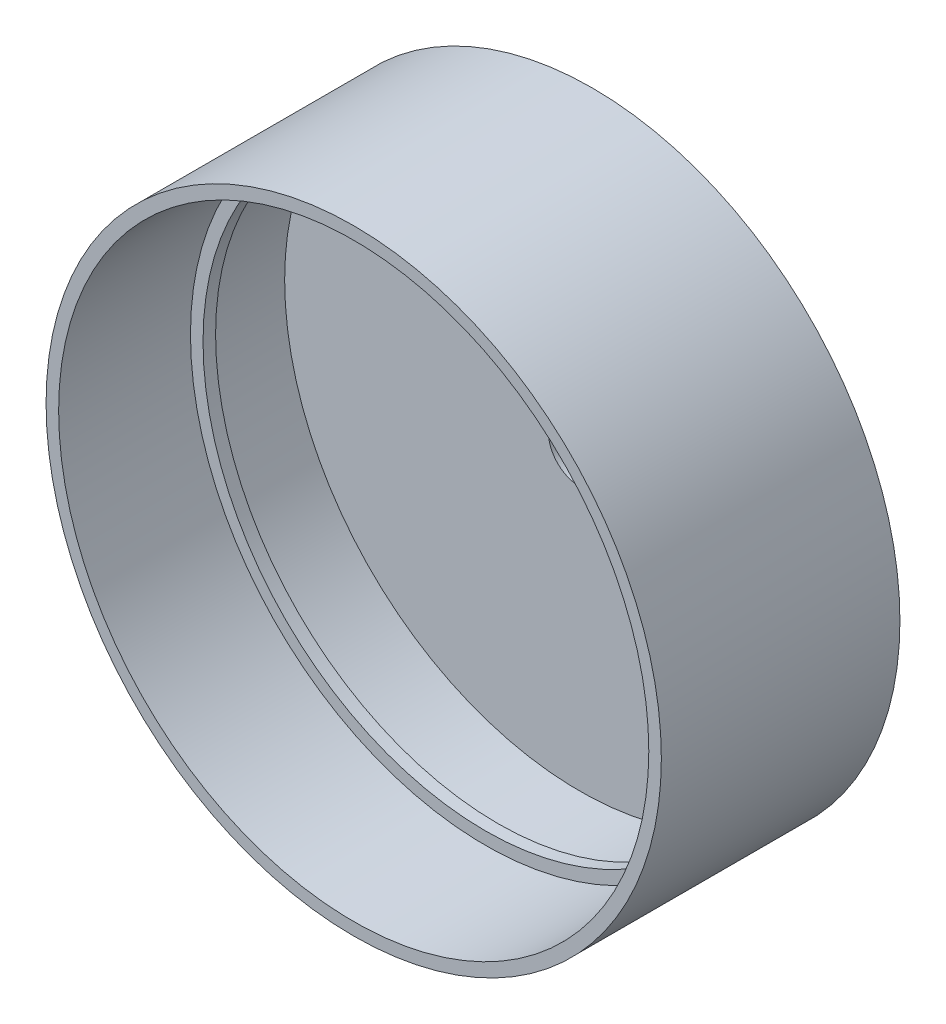
ISO-10303-21;
HEADER;
FILE_DESCRIPTION(('STEP AP214'),'2;1');
FILE_NAME('part.step','',(''),(''),'','','');
FILE_SCHEMA(('AUTOMOTIVE_DESIGN { 1 0 10303 214 1 1 1 1 }'));
ENDSEC;
DATA;
#1=APPLICATION_CONTEXT('core data for automotive mechanical design processes');
#2=APPLICATION_PROTOCOL_DEFINITION('international standard','automotive_design',2000,#1);
#3=PRODUCT_CONTEXT('',#1,'mechanical');
#4=PRODUCT('Part','Part','',(#3));
#5=PRODUCT_RELATED_PRODUCT_CATEGORY('part','',(#4));
#6=PRODUCT_DEFINITION_FORMATION('','',#4);
#7=PRODUCT_DEFINITION_CONTEXT('part definition',#1,'design');
#8=PRODUCT_DEFINITION('design','',#6,#7);
#9=PRODUCT_DEFINITION_SHAPE('','',#8);
#10=(LENGTH_UNIT() NAMED_UNIT(*) SI_UNIT(.MILLI.,.METRE.));
#11=(NAMED_UNIT(*) PLANE_ANGLE_UNIT() SI_UNIT($,.RADIAN.));
#12=(NAMED_UNIT(*) SI_UNIT($,.STERADIAN.) SOLID_ANGLE_UNIT());
#13=UNCERTAINTY_MEASURE_WITH_UNIT(LENGTH_MEASURE(1.E-05),#10,'distance_accuracy_value','');
#14=(GEOMETRIC_REPRESENTATION_CONTEXT(3) GLOBAL_UNCERTAINTY_ASSIGNED_CONTEXT((#13)) GLOBAL_UNIT_ASSIGNED_CONTEXT((#10,
#11,#12)) REPRESENTATION_CONTEXT('',''));
#15=CARTESIAN_POINT('',(0.,0.,0.));
#16=DIRECTION('',(0.,0.,1.));
#17=DIRECTION('',(1.,0.,0.));
#18=AXIS2_PLACEMENT_3D('',#15,#16,#17);
#19=CARTESIAN_POINT('',(0.,0.,38.));
#20=DIRECTION('',(0.,0.,-1.));
#21=DIRECTION('',(-1.,0.,0.));
#22=AXIS2_PLACEMENT_3D('',#19,#20,#21);
#23=CYLINDRICAL_SURFACE('',#22,47.);
#24=CARTESIAN_POINT('',(0.,0.,2.));
#25=DIRECTION('',(0.,0.,1.));
#26=DIRECTION('',(1.,0.,0.));
#27=AXIS2_PLACEMENT_3D('',#24,#25,#26);
#28=CIRCLE('',#27,47.);
#29=CARTESIAN_POINT('',(47.,0.,2.));
#30=VERTEX_POINT('',#29);
#31=EDGE_CURVE('E38',#30,#30,#28,.T.);
#32=ORIENTED_EDGE('',*,*,#31,.F.);
#33=EDGE_LOOP('',(#32));
#34=FACE_BOUND('',#33,.T.);
#35=CARTESIAN_POINT('',(0.,0.,15.));
#36=DIRECTION('',(0.,0.,1.));
#37=DIRECTION('',(1.,0.,0.));
#38=AXIS2_PLACEMENT_3D('',#35,#36,#37);
#39=CIRCLE('',#38,47.);
#40=CARTESIAN_POINT('',(47.,0.,15.));
#41=VERTEX_POINT('',#40);
#42=EDGE_CURVE('E50',#41,#41,#39,.T.);
#43=ORIENTED_EDGE('',*,*,#42,.T.);
#44=EDGE_LOOP('',(#43));
#45=FACE_BOUND('',#44,.T.);
#46=ADVANCED_FACE('F31',(#34,#45),#23,.F.);
#47=CARTESIAN_POINT('',(0.,0.,38.));
#48=DIRECTION('',(0.,0.,1.));
#49=DIRECTION('',(1.,0.,0.));
#50=AXIS2_PLACEMENT_3D('',#47,#48,#49);
#51=PLANE('',#50);
#52=CARTESIAN_POINT('',(0.,0.,38.));
#53=DIRECTION('',(0.,0.,1.));
#54=DIRECTION('',(1.,0.,0.));
#55=AXIS2_PLACEMENT_3D('',#52,#53,#54);
#56=CIRCLE('',#55,49.);
#57=CARTESIAN_POINT('',(49.,0.,38.));
#58=VERTEX_POINT('',#57);
#59=EDGE_CURVE('E42',#58,#58,#56,.T.);
#60=ORIENTED_EDGE('',*,*,#59,.T.);
#61=EDGE_LOOP('',(#60));
#62=FACE_BOUND('',#61,.T.);
#63=CARTESIAN_POINT('',(0.,0.,38.));
#64=DIRECTION('',(0.,0.,1.));
#65=DIRECTION('',(1.,0.,0.));
#66=AXIS2_PLACEMENT_3D('',#63,#64,#65);
#67=CIRCLE('',#66,47.);
#68=CARTESIAN_POINT('',(47.,0.,38.));
#69=VERTEX_POINT('',#68);
#70=EDGE_CURVE('E68',#69,#69,#67,.T.);
#71=ORIENTED_EDGE('',*,*,#70,.F.);
#72=EDGE_LOOP('',(#71));
#73=FACE_BOUND('',#72,.T.);
#74=ADVANCED_FACE('F80',(#62,#73),#51,.T.);
#75=CARTESIAN_POINT('',(0.,0.,0.));
#76=DIRECTION('',(0.,0.,1.));
#77=DIRECTION('',(1.,0.,0.));
#78=AXIS2_PLACEMENT_3D('',#75,#76,#77);
#79=PLANE('',#78);
#80=CARTESIAN_POINT('',(0.,0.,0.));
#81=DIRECTION('',(0.,0.,1.));
#82=DIRECTION('',(1.,0.,0.));
#83=AXIS2_PLACEMENT_3D('',#80,#81,#82);
#84=CIRCLE('',#83,49.);
#85=CARTESIAN_POINT('',(49.,0.,0.));
#86=VERTEX_POINT('',#85);
#87=EDGE_CURVE('E47',#86,#86,#84,.T.);
#88=ORIENTED_EDGE('',*,*,#87,.F.);
#89=EDGE_LOOP('',(#88));
#90=FACE_BOUND('',#89,.T.);
#91=CARTESIAN_POINT('',(0.,0.,0.));
#92=DIRECTION('',(0.,0.,1.));
#93=DIRECTION('',(1.,0.,0.));
#94=AXIS2_PLACEMENT_3D('',#91,#92,#93);
#95=CIRCLE('',#94,5.);
#96=CARTESIAN_POINT('',(5.,0.,0.));
#97=VERTEX_POINT('',#96);
#98=EDGE_CURVE('E52',#97,#97,#95,.T.);
#99=ORIENTED_EDGE('',*,*,#98,.T.);
#100=EDGE_LOOP('',(#99));
#101=FACE_BOUND('',#100,.T.);
#102=ADVANCED_FACE('F77',(#90,#101),#79,.F.);
#103=CARTESIAN_POINT('',(0.,0.,38.));
#104=DIRECTION('',(0.,0.,-1.));
#105=DIRECTION('',(-1.,0.,0.));
#106=AXIS2_PLACEMENT_3D('',#103,#104,#105);
#107=CYLINDRICAL_SURFACE('',#106,49.);
#108=ORIENTED_EDGE('',*,*,#59,.F.);
#109=EDGE_LOOP('',(#108));
#110=FACE_BOUND('',#109,.T.);
#111=ORIENTED_EDGE('',*,*,#87,.T.);
#112=EDGE_LOOP('',(#111));
#113=FACE_BOUND('',#112,.T.);
#114=ADVANCED_FACE('F33',(#110,#113),#107,.T.);
#115=CARTESIAN_POINT('',(0.,0.,17.));
#116=DIRECTION('',(0.,0.,1.));
#117=DIRECTION('',(1.,0.,0.));
#118=AXIS2_PLACEMENT_3D('',#115,#116,#117);
#119=CIRCLE('',#118,47.);
#120=CARTESIAN_POINT('',(47.,0.,17.));
#121=VERTEX_POINT('',#120);
#122=EDGE_CURVE('E10',#121,#121,#119,.T.);
#123=ORIENTED_EDGE('',*,*,#122,.F.);
#124=EDGE_LOOP('',(#123));
#125=FACE_BOUND('',#124,.T.);
#126=ORIENTED_EDGE('',*,*,#70,.T.);
#127=EDGE_LOOP('',(#126));
#128=FACE_BOUND('',#127,.T.);
#129=ADVANCED_FACE('F96',(#125,#128),#23,.F.);
#130=CARTESIAN_POINT('',(0.,0.,2.));
#131=DIRECTION('',(0.,0.,1.));
#132=DIRECTION('',(1.,0.,0.));
#133=AXIS2_PLACEMENT_3D('',#130,#131,#132);
#134=PLANE('',#133);
#135=CARTESIAN_POINT('',(0.,0.,2.));
#136=DIRECTION('',(0.,0.,1.));
#137=DIRECTION('',(1.,0.,0.));
#138=AXIS2_PLACEMENT_3D('',#135,#136,#137);
#139=CIRCLE('',#138,5.);
#140=CARTESIAN_POINT('',(5.,0.,2.));
#141=VERTEX_POINT('',#140);
#142=EDGE_CURVE('E57',#141,#141,#139,.T.);
#143=ORIENTED_EDGE('',*,*,#142,.F.);
#144=EDGE_LOOP('',(#143));
#145=FACE_BOUND('',#144,.T.);
#146=ORIENTED_EDGE('',*,*,#31,.T.);
#147=EDGE_LOOP('',(#146));
#148=FACE_BOUND('',#147,.T.);
#149=ADVANCED_FACE('F86',(#145,#148),#134,.T.);
#150=CARTESIAN_POINT('',(0.,0.,2.));
#151=DIRECTION('',(0.,0.,-1.));
#152=DIRECTION('',(-1.,0.,0.));
#153=AXIS2_PLACEMENT_3D('',#150,#151,#152);
#154=CYLINDRICAL_SURFACE('',#153,5.);
#155=ORIENTED_EDGE('',*,*,#142,.T.);
#156=EDGE_LOOP('',(#155));
#157=FACE_BOUND('',#156,.T.);
#158=ORIENTED_EDGE('',*,*,#98,.F.);
#159=EDGE_LOOP('',(#158));
#160=FACE_BOUND('',#159,.T.);
#161=ADVANCED_FACE('F83',(#157,#160),#154,.F.);
#162=CARTESIAN_POINT('',(0.,0.,17.));
#163=DIRECTION('',(0.,0.,1.));
#164=DIRECTION('',(1.,0.,0.));
#165=AXIS2_PLACEMENT_3D('',#162,#163,#164);
#166=PLANE('',#165);
#167=CARTESIAN_POINT('',(0.,0.,17.));
#168=DIRECTION('',(0.,0.,1.));
#169=DIRECTION('',(1.,0.,0.));
#170=AXIS2_PLACEMENT_3D('',#167,#168,#169);
#171=CIRCLE('',#170,45.);
#172=CARTESIAN_POINT('',(45.,0.,17.));
#173=VERTEX_POINT('',#172);
#174=EDGE_CURVE('E53',#173,#173,#171,.T.);
#175=ORIENTED_EDGE('',*,*,#174,.F.);
#176=EDGE_LOOP('',(#175));
#177=FACE_BOUND('',#176,.T.);
#178=ORIENTED_EDGE('',*,*,#122,.T.);
#179=EDGE_LOOP('',(#178));
#180=FACE_BOUND('',#179,.T.);
#181=ADVANCED_FACE('F85',(#177,#180),#166,.T.);
#182=CARTESIAN_POINT('',(0.,0.,15.));
#183=DIRECTION('',(0.,0.,1.));
#184=DIRECTION('',(1.,0.,0.));
#185=AXIS2_PLACEMENT_3D('',#182,#183,#184);
#186=PLANE('',#185);
#187=CARTESIAN_POINT('',(0.,0.,15.));
#188=DIRECTION('',(0.,0.,1.));
#189=DIRECTION('',(1.,0.,0.));
#190=AXIS2_PLACEMENT_3D('',#187,#188,#189);
#191=CIRCLE('',#190,45.);
#192=CARTESIAN_POINT('',(45.,0.,15.));
#193=VERTEX_POINT('',#192);
#194=EDGE_CURVE('E60',#193,#193,#191,.T.);
#195=ORIENTED_EDGE('',*,*,#194,.T.);
#196=EDGE_LOOP('',(#195));
#197=FACE_BOUND('',#196,.T.);
#198=ORIENTED_EDGE('',*,*,#42,.F.);
#199=EDGE_LOOP('',(#198));
#200=FACE_BOUND('',#199,.T.);
#201=ADVANCED_FACE('F93',(#197,#200),#186,.F.);
#202=CARTESIAN_POINT('',(0.,0.,17.));
#203=DIRECTION('',(0.,0.,-1.));
#204=DIRECTION('',(-1.,0.,0.));
#205=AXIS2_PLACEMENT_3D('',#202,#203,#204);
#206=CYLINDRICAL_SURFACE('',#205,45.);
#207=ORIENTED_EDGE('',*,*,#174,.T.);
#208=EDGE_LOOP('',(#207));
#209=FACE_BOUND('',#208,.T.);
#210=ORIENTED_EDGE('',*,*,#194,.F.);
#211=EDGE_LOOP('',(#210));
#212=FACE_BOUND('',#211,.T.);
#213=ADVANCED_FACE('F155',(#209,#212),#206,.F.);
#214=CLOSED_SHELL('',(#46,#74,#102,#114,#129,#149,#161,#181,#201,#213));
#215=MANIFOLD_SOLID_BREP('B2',#214);
#216=ADVANCED_BREP_SHAPE_REPRESENTATION('',(#18,#215),#14);
#217=SHAPE_DEFINITION_REPRESENTATION(#9,#216);
ENDSEC;
END-ISO-10303-21;
